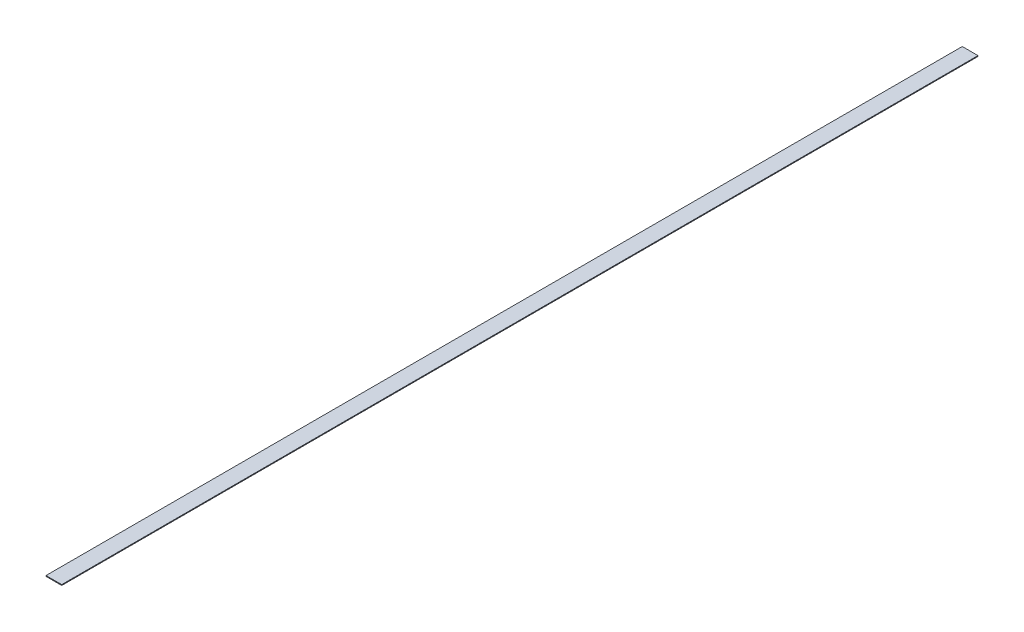
ISO-10303-21;
HEADER;
FILE_DESCRIPTION(('STEP AP214'),'2;1');
FILE_NAME('part.step','',(''),(''),'','','');
FILE_SCHEMA(('AUTOMOTIVE_DESIGN { 1 0 10303 214 1 1 1 1 }'));
ENDSEC;
DATA;
#1=APPLICATION_CONTEXT('core data for automotive mechanical design processes');
#2=APPLICATION_PROTOCOL_DEFINITION('international standard','automotive_design',2000,#1);
#3=PRODUCT_CONTEXT('',#1,'mechanical');
#4=PRODUCT('Part','Part','',(#3));
#5=PRODUCT_RELATED_PRODUCT_CATEGORY('part','',(#4));
#6=PRODUCT_DEFINITION_FORMATION('','',#4);
#7=PRODUCT_DEFINITION_CONTEXT('part definition',#1,'design');
#8=PRODUCT_DEFINITION('design','',#6,#7);
#9=PRODUCT_DEFINITION_SHAPE('','',#8);
#10=(LENGTH_UNIT() NAMED_UNIT(*) SI_UNIT(.MILLI.,.METRE.));
#11=(NAMED_UNIT(*) PLANE_ANGLE_UNIT() SI_UNIT($,.RADIAN.));
#12=(NAMED_UNIT(*) SI_UNIT($,.STERADIAN.) SOLID_ANGLE_UNIT());
#13=UNCERTAINTY_MEASURE_WITH_UNIT(LENGTH_MEASURE(1.E-05),#10,'distance_accuracy_value','');
#14=(GEOMETRIC_REPRESENTATION_CONTEXT(3) GLOBAL_UNCERTAINTY_ASSIGNED_CONTEXT((#13)) GLOBAL_UNIT_ASSIGNED_CONTEXT((#10,
#11,#12)) REPRESENTATION_CONTEXT('',''));
#15=CARTESIAN_POINT('',(0.,0.,0.));
#16=DIRECTION('',(0.,0.,1.));
#17=DIRECTION('',(1.,0.,0.));
#18=AXIS2_PLACEMENT_3D('',#15,#16,#17);
#19=CARTESIAN_POINT('',(25.4,2.54,1479.55));
#20=DIRECTION('',(-1.,0.,0.));
#21=DIRECTION('',(0.,0.,1.));
#22=AXIS2_PLACEMENT_3D('',#19,#20,#21);
#23=PLANE('',#22);
#24=DIRECTION('',(0.,0.,-1.));
#25=VECTOR('',#24,1.);
#26=CARTESIAN_POINT('',(25.4,0.,1479.55));
#27=LINE('',#26,#25);
#28=CARTESIAN_POINT('',(25.4,0.,1479.55));
#29=VERTEX_POINT('',#28);
#30=CARTESIAN_POINT('',(25.4,0.,-1479.55));
#31=VERTEX_POINT('',#30);
#32=EDGE_CURVE('E97',#29,#31,#27,.T.);
#33=ORIENTED_EDGE('',*,*,#32,.T.);
#34=DIRECTION('',(0.,-1.,0.));
#35=VECTOR('',#34,1.);
#36=CARTESIAN_POINT('',(25.4,2.54,-1479.55));
#37=LINE('',#36,#35);
#38=CARTESIAN_POINT('',(25.4,2.54,-1479.55));
#39=VERTEX_POINT('',#38);
#40=EDGE_CURVE('E11',#39,#31,#37,.T.);
#41=ORIENTED_EDGE('',*,*,#40,.F.);
#42=DIRECTION('',(0.,0.,-1.));
#43=VECTOR('',#42,1.);
#44=CARTESIAN_POINT('',(25.4,2.54,1479.55));
#45=LINE('',#44,#43);
#46=CARTESIAN_POINT('',(25.4,2.54,1479.55));
#47=VERTEX_POINT('',#46);
#48=EDGE_CURVE('E85',#47,#39,#45,.T.);
#49=ORIENTED_EDGE('',*,*,#48,.F.);
#50=DIRECTION('',(0.,-1.,0.));
#51=VECTOR('',#50,1.);
#52=CARTESIAN_POINT('',(25.4,2.54,1479.55));
#53=LINE('',#52,#51);
#54=EDGE_CURVE('E93',#47,#29,#53,.T.);
#55=ORIENTED_EDGE('',*,*,#54,.T.);
#56=EDGE_LOOP('',(#33,#41,#49,#55));
#57=FACE_BOUND('',#56,.T.);
#58=ADVANCED_FACE('F34',(#57),#23,.F.);
#59=CARTESIAN_POINT('',(-25.4,2.54,-1479.55));
#60=DIRECTION('',(0.,0.,1.));
#61=DIRECTION('',(1.,0.,0.));
#62=AXIS2_PLACEMENT_3D('',#59,#60,#61);
#63=PLANE('',#62);
#64=DIRECTION('',(-1.,0.,0.));
#65=VECTOR('',#64,1.);
#66=CARTESIAN_POINT('',(-25.4,0.,-1479.55));
#67=LINE('',#66,#65);
#68=CARTESIAN_POINT('',(-25.4,0.,-1479.55));
#69=VERTEX_POINT('',#68);
#70=EDGE_CURVE('E89',#31,#69,#67,.T.);
#71=ORIENTED_EDGE('',*,*,#70,.T.);
#72=DIRECTION('',(0.,-1.,0.));
#73=VECTOR('',#72,1.);
#74=CARTESIAN_POINT('',(-25.4,2.54,-1479.55));
#75=LINE('',#74,#73);
#76=CARTESIAN_POINT('',(-25.4,2.54,-1479.55));
#77=VERTEX_POINT('',#76);
#78=EDGE_CURVE('E42',#77,#69,#75,.T.);
#79=ORIENTED_EDGE('',*,*,#78,.F.);
#80=DIRECTION('',(-1.,0.,0.));
#81=VECTOR('',#80,1.);
#82=CARTESIAN_POINT('',(-25.4,2.54,-1479.55));
#83=LINE('',#82,#81);
#84=EDGE_CURVE('E80',#39,#77,#83,.T.);
#85=ORIENTED_EDGE('',*,*,#84,.F.);
#86=ORIENTED_EDGE('',*,*,#40,.T.);
#87=EDGE_LOOP('',(#71,#79,#85,#86));
#88=FACE_BOUND('',#87,.T.);
#89=ADVANCED_FACE('F88',(#88),#63,.F.);
#90=CARTESIAN_POINT('',(-25.4,2.54,1479.55));
#91=DIRECTION('',(1.,0.,0.));
#92=DIRECTION('',(0.,0.,-1.));
#93=AXIS2_PLACEMENT_3D('',#90,#91,#92);
#94=PLANE('',#93);
#95=DIRECTION('',(0.,0.,1.));
#96=VECTOR('',#95,1.);
#97=CARTESIAN_POINT('',(-25.4,0.,1479.55));
#98=LINE('',#97,#96);
#99=CARTESIAN_POINT('',(-25.4,0.,1479.55));
#100=VERTEX_POINT('',#99);
#101=EDGE_CURVE('E67',#69,#100,#98,.T.);
#102=ORIENTED_EDGE('',*,*,#101,.T.);
#103=DIRECTION('',(0.,-1.,0.));
#104=VECTOR('',#103,1.);
#105=CARTESIAN_POINT('',(-25.4,2.54,1479.55));
#106=LINE('',#105,#104);
#107=CARTESIAN_POINT('',(-25.4,2.54,1479.55));
#108=VERTEX_POINT('',#107);
#109=EDGE_CURVE('E90',#108,#100,#106,.T.);
#110=ORIENTED_EDGE('',*,*,#109,.F.);
#111=DIRECTION('',(0.,0.,1.));
#112=VECTOR('',#111,1.);
#113=CARTESIAN_POINT('',(-25.4,2.54,1479.55));
#114=LINE('',#113,#112);
#115=EDGE_CURVE('E83',#77,#108,#114,.T.);
#116=ORIENTED_EDGE('',*,*,#115,.F.);
#117=ORIENTED_EDGE('',*,*,#78,.T.);
#118=EDGE_LOOP('',(#102,#110,#116,#117));
#119=FACE_BOUND('',#118,.T.);
#120=ADVANCED_FACE('F91',(#119),#94,.F.);
#121=CARTESIAN_POINT('',(-25.4,2.54,1479.55));
#122=DIRECTION('',(0.,0.,-1.));
#123=DIRECTION('',(-1.,0.,0.));
#124=AXIS2_PLACEMENT_3D('',#121,#122,#123);
#125=PLANE('',#124);
#126=DIRECTION('',(1.,0.,0.));
#127=VECTOR('',#126,1.);
#128=CARTESIAN_POINT('',(-25.4,0.,1479.55));
#129=LINE('',#128,#127);
#130=EDGE_CURVE('E73',#100,#29,#129,.T.);
#131=ORIENTED_EDGE('',*,*,#130,.T.);
#132=ORIENTED_EDGE('',*,*,#54,.F.);
#133=DIRECTION('',(1.,0.,0.));
#134=VECTOR('',#133,1.);
#135=CARTESIAN_POINT('',(-25.4,2.54,1479.55));
#136=LINE('',#135,#134);
#137=EDGE_CURVE('E50',#108,#47,#136,.T.);
#138=ORIENTED_EDGE('',*,*,#137,.F.);
#139=ORIENTED_EDGE('',*,*,#109,.T.);
#140=EDGE_LOOP('',(#131,#132,#138,#139));
#141=FACE_BOUND('',#140,.T.);
#142=ADVANCED_FACE('F104',(#141),#125,.F.);
#143=CARTESIAN_POINT('',(0.,2.54,0.));
#144=DIRECTION('',(0.,-1.,0.));
#145=DIRECTION('',(0.,0.,-1.));
#146=AXIS2_PLACEMENT_3D('',#143,#144,#145);
#147=PLANE('',#146);
#148=ORIENTED_EDGE('',*,*,#48,.T.);
#149=ORIENTED_EDGE('',*,*,#84,.T.);
#150=ORIENTED_EDGE('',*,*,#115,.T.);
#151=ORIENTED_EDGE('',*,*,#137,.T.);
#152=EDGE_LOOP('',(#148,#149,#150,#151));
#153=FACE_BOUND('',#152,.T.);
#154=ADVANCED_FACE('F81',(#153),#147,.F.);
#155=CARTESIAN_POINT('',(0.,0.,0.));
#156=DIRECTION('',(0.,-1.,0.));
#157=DIRECTION('',(0.,0.,-1.));
#158=AXIS2_PLACEMENT_3D('',#155,#156,#157);
#159=PLANE('',#158);
#160=ORIENTED_EDGE('',*,*,#32,.F.);
#161=ORIENTED_EDGE('',*,*,#130,.F.);
#162=ORIENTED_EDGE('',*,*,#101,.F.);
#163=ORIENTED_EDGE('',*,*,#70,.F.);
#164=EDGE_LOOP('',(#160,#161,#162,#163));
#165=FACE_BOUND('',#164,.T.);
#166=ADVANCED_FACE('F107',(#165),#159,.T.);
#167=CLOSED_SHELL('',(#58,#89,#120,#142,#154,#166));
#168=MANIFOLD_SOLID_BREP('B2',#167);
#169=ADVANCED_BREP_SHAPE_REPRESENTATION('',(#18,#168),#14);
#170=SHAPE_DEFINITION_REPRESENTATION(#9,#169);
ENDSEC;
END-ISO-10303-21;
